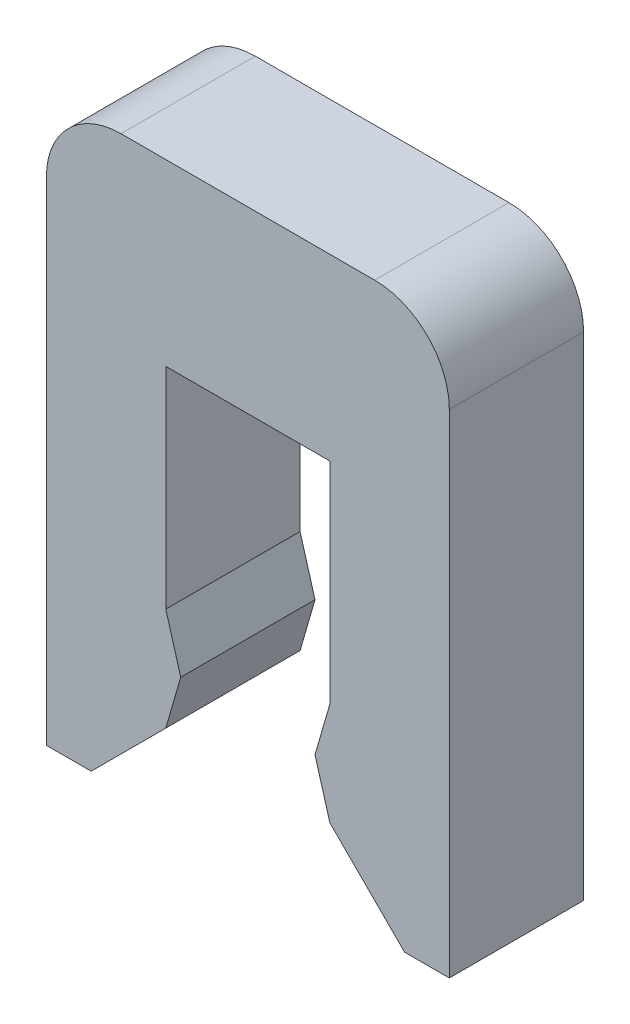
ISO-10303-21;
HEADER;
FILE_DESCRIPTION(('STEP AP214'),'2;1');
FILE_NAME('part.step','',(''),(''),'','','');
FILE_SCHEMA(('AUTOMOTIVE_DESIGN { 1 0 10303 214 1 1 1 1 }'));
ENDSEC;
DATA;
#1=APPLICATION_CONTEXT('core data for automotive mechanical design processes');
#2=APPLICATION_PROTOCOL_DEFINITION('international standard','automotive_design',2000,#1);
#3=PRODUCT_CONTEXT('',#1,'mechanical');
#4=PRODUCT('Part','Part','',(#3));
#5=PRODUCT_RELATED_PRODUCT_CATEGORY('part','',(#4));
#6=PRODUCT_DEFINITION_FORMATION('','',#4);
#7=PRODUCT_DEFINITION_CONTEXT('part definition',#1,'design');
#8=PRODUCT_DEFINITION('design','',#6,#7);
#9=PRODUCT_DEFINITION_SHAPE('','',#8);
#10=(LENGTH_UNIT() NAMED_UNIT(*) SI_UNIT(.MILLI.,.METRE.));
#11=(NAMED_UNIT(*) PLANE_ANGLE_UNIT() SI_UNIT($,.RADIAN.));
#12=(NAMED_UNIT(*) SI_UNIT($,.STERADIAN.) SOLID_ANGLE_UNIT());
#13=UNCERTAINTY_MEASURE_WITH_UNIT(LENGTH_MEASURE(1.E-05),#10,'distance_accuracy_value','');
#14=(GEOMETRIC_REPRESENTATION_CONTEXT(3) GLOBAL_UNCERTAINTY_ASSIGNED_CONTEXT((#13)) GLOBAL_UNIT_ASSIGNED_CONTEXT((#10,
#11,#12)) REPRESENTATION_CONTEXT('',''));
#15=CARTESIAN_POINT('',(0.,0.,0.));
#16=DIRECTION('',(0.,0.,1.));
#17=DIRECTION('',(1.,0.,0.));
#18=AXIS2_PLACEMENT_3D('',#15,#16,#17);
#19=CARTESIAN_POINT('',(0.55,0.,0.9));
#20=DIRECTION('',(1.,0.,0.));
#21=DIRECTION('',(0.,1.,0.));
#22=AXIS2_PLACEMENT_3D('',#19,#20,#21);
#23=PLANE('',#22);
#24=DIRECTION('',(0.,0.,1.));
#25=VECTOR('',#24,1.);
#26=CARTESIAN_POINT('',(0.55,-1.40904092317434,0.));
#27=LINE('',#26,#25);
#28=CARTESIAN_POINT('',(0.55,-1.40904092317434,0.));
#29=VERTEX_POINT('',#28);
#30=CARTESIAN_POINT('',(0.55,-1.40904092317434,0.9));
#31=VERTEX_POINT('',#30);
#32=EDGE_CURVE('E50',#29,#31,#27,.T.);
#33=ORIENTED_EDGE('',*,*,#32,.T.);
#34=DIRECTION('',(0.,-1.,0.));
#35=VECTOR('',#34,1.);
#36=CARTESIAN_POINT('',(0.55,0.,0.9));
#37=LINE('',#36,#35);
#38=CARTESIAN_POINT('',(0.55,0.,0.9));
#39=VERTEX_POINT('',#38);
#40=EDGE_CURVE('E193',#39,#31,#37,.T.);
#41=ORIENTED_EDGE('',*,*,#40,.F.);
#42=DIRECTION('',(0.,0.,-1.));
#43=VECTOR('',#42,1.);
#44=CARTESIAN_POINT('',(0.55,0.,0.9));
#45=LINE('',#44,#43);
#46=CARTESIAN_POINT('',(0.55,0.,0.));
#47=VERTEX_POINT('',#46);
#48=EDGE_CURVE('E213',#39,#47,#45,.T.);
#49=ORIENTED_EDGE('',*,*,#48,.T.);
#50=DIRECTION('',(0.,-1.,0.));
#51=VECTOR('',#50,1.);
#52=CARTESIAN_POINT('',(0.55,0.,0.));
#53=LINE('',#52,#51);
#54=EDGE_CURVE('E55',#47,#29,#53,.T.);
#55=ORIENTED_EDGE('',*,*,#54,.T.);
#56=EDGE_LOOP('',(#33,#41,#49,#55));
#57=FACE_BOUND('',#56,.T.);
#58=ADVANCED_FACE('F35',(#57),#23,.F.);
#59=CARTESIAN_POINT('',(0.55,-2.6,0.9));
#60=DIRECTION('',(0.,1.,0.));
#61=DIRECTION('',(0.,0.,1.));
#62=AXIS2_PLACEMENT_3D('',#59,#60,#61);
#63=PLANE('',#62);
#64=DIRECTION('',(1.,0.,0.));
#65=VECTOR('',#64,1.);
#66=CARTESIAN_POINT('',(0.55,-2.6,0.9));
#67=LINE('',#66,#65);
#68=CARTESIAN_POINT('',(1.05,-2.6,0.9));
#69=VERTEX_POINT('',#68);
#70=CARTESIAN_POINT('',(1.35,-2.6,0.9));
#71=VERTEX_POINT('',#70);
#72=EDGE_CURVE('E195',#69,#71,#67,.T.);
#73=ORIENTED_EDGE('',*,*,#72,.F.);
#74=DIRECTION('',(0.,0.,-1.));
#75=VECTOR('',#74,1.);
#76=CARTESIAN_POINT('',(1.05,-2.6,0.9));
#77=LINE('',#76,#75);
#78=CARTESIAN_POINT('',(1.05,-2.6,0.));
#79=VERTEX_POINT('',#78);
#80=EDGE_CURVE('E253',#69,#79,#77,.T.);
#81=ORIENTED_EDGE('',*,*,#80,.T.);
#82=DIRECTION('',(1.,0.,0.));
#83=VECTOR('',#82,1.);
#84=CARTESIAN_POINT('',(0.55,-2.6,0.));
#85=LINE('',#84,#83);
#86=CARTESIAN_POINT('',(1.35,-2.6,0.));
#87=VERTEX_POINT('',#86);
#88=EDGE_CURVE('E215',#79,#87,#85,.T.);
#89=ORIENTED_EDGE('',*,*,#88,.T.);
#90=DIRECTION('',(0.,0.,-1.));
#91=VECTOR('',#90,1.);
#92=CARTESIAN_POINT('',(1.35,-2.6,0.9));
#93=LINE('',#92,#91);
#94=EDGE_CURVE('E238',#71,#87,#93,.T.);
#95=ORIENTED_EDGE('',*,*,#94,.F.);
#96=EDGE_LOOP('',(#73,#81,#89,#95));
#97=FACE_BOUND('',#96,.T.);
#98=ADVANCED_FACE('F289',(#97),#63,.F.);
#99=CARTESIAN_POINT('',(1.35,-2.6,0.9));
#100=DIRECTION('',(-1.,0.,0.));
#101=DIRECTION('',(0.,0.,1.));
#102=AXIS2_PLACEMENT_3D('',#99,#100,#101);
#103=PLANE('',#102);
#104=DIRECTION('',(0.,1.,0.));
#105=VECTOR('',#104,1.);
#106=CARTESIAN_POINT('',(1.35,-2.6,0.));
#107=LINE('',#106,#105);
#108=CARTESIAN_POINT('',(1.35,0.699999999999999,0.));
#109=VERTEX_POINT('',#108);
#110=EDGE_CURVE('E217',#87,#109,#107,.T.);
#111=ORIENTED_EDGE('',*,*,#110,.T.);
#112=DIRECTION('',(0.,0.,-1.));
#113=VECTOR('',#112,1.);
#114=CARTESIAN_POINT('',(1.35,0.7,0.9));
#115=LINE('',#114,#113);
#116=CARTESIAN_POINT('',(1.35,0.699999999999999,0.9));
#117=VERTEX_POINT('',#116);
#118=EDGE_CURVE('E267',#109,#117,#115,.F.);
#119=ORIENTED_EDGE('',*,*,#118,.T.);
#120=DIRECTION('',(0.,1.,0.));
#121=VECTOR('',#120,1.);
#122=CARTESIAN_POINT('',(1.35,-2.6,0.9));
#123=LINE('',#122,#121);
#124=EDGE_CURVE('E198',#71,#117,#123,.T.);
#125=ORIENTED_EDGE('',*,*,#124,.F.);
#126=ORIENTED_EDGE('',*,*,#94,.T.);
#127=EDGE_LOOP('',(#111,#119,#125,#126));
#128=FACE_BOUND('',#127,.T.);
#129=ADVANCED_FACE('F285',(#128),#103,.F.);
#130=CARTESIAN_POINT('',(1.35,1.2,0.9));
#131=DIRECTION('',(0.,-1.,0.));
#132=DIRECTION('',(1.,0.,0.));
#133=AXIS2_PLACEMENT_3D('',#130,#131,#132);
#134=PLANE('',#133);
#135=DIRECTION('',(-1.,0.,0.));
#136=VECTOR('',#135,1.);
#137=CARTESIAN_POINT('',(1.35,1.2,0.9));
#138=LINE('',#137,#136);
#139=CARTESIAN_POINT('',(0.850000000000001,1.2,0.9));
#140=VERTEX_POINT('',#139);
#141=CARTESIAN_POINT('',(-0.85,1.2,0.9));
#142=VERTEX_POINT('',#141);
#143=EDGE_CURVE('E201',#140,#142,#138,.T.);
#144=ORIENTED_EDGE('',*,*,#143,.F.);
#145=DIRECTION('',(0.,0.,-1.));
#146=VECTOR('',#145,1.);
#147=CARTESIAN_POINT('',(0.850000000000001,1.2,0.9));
#148=LINE('',#147,#146);
#149=CARTESIAN_POINT('',(0.850000000000001,1.2,0.));
#150=VERTEX_POINT('',#149);
#151=EDGE_CURVE('E260',#140,#150,#148,.T.);
#152=ORIENTED_EDGE('',*,*,#151,.T.);
#153=DIRECTION('',(-1.,0.,0.));
#154=VECTOR('',#153,1.);
#155=CARTESIAN_POINT('',(1.35,1.2,0.));
#156=LINE('',#155,#154);
#157=CARTESIAN_POINT('',(-0.85,1.2,0.));
#158=VERTEX_POINT('',#157);
#159=EDGE_CURVE('E220',#150,#158,#156,.T.);
#160=ORIENTED_EDGE('',*,*,#159,.T.);
#161=DIRECTION('',(0.,0.,-1.));
#162=VECTOR('',#161,1.);
#163=CARTESIAN_POINT('',(-0.850000000000001,1.2,0.9));
#164=LINE('',#163,#162);
#165=EDGE_CURVE('E258',#158,#142,#164,.F.);
#166=ORIENTED_EDGE('',*,*,#165,.T.);
#167=EDGE_LOOP('',(#144,#152,#160,#166));
#168=FACE_BOUND('',#167,.T.);
#169=ADVANCED_FACE('F280',(#168),#134,.F.);
#170=CARTESIAN_POINT('',(-1.35,-2.6,0.9));
#171=DIRECTION('',(1.,0.,0.));
#172=DIRECTION('',(0.,1.,0.));
#173=AXIS2_PLACEMENT_3D('',#170,#171,#172);
#174=PLANE('',#173);
#175=DIRECTION('',(0.,-1.,0.));
#176=VECTOR('',#175,1.);
#177=CARTESIAN_POINT('',(-1.35,-2.6,0.9));
#178=LINE('',#177,#176);
#179=CARTESIAN_POINT('',(-1.35,0.7,0.9));
#180=VERTEX_POINT('',#179);
#181=CARTESIAN_POINT('',(-1.35,-2.6,0.9));
#182=VERTEX_POINT('',#181);
#183=EDGE_CURVE('E204',#180,#182,#178,.T.);
#184=ORIENTED_EDGE('',*,*,#183,.F.);
#185=DIRECTION('',(0.,0.,-1.));
#186=VECTOR('',#185,1.);
#187=CARTESIAN_POINT('',(-1.35,0.7,0.9));
#188=LINE('',#187,#186);
#189=CARTESIAN_POINT('',(-1.35,0.7,0.));
#190=VERTEX_POINT('',#189);
#191=EDGE_CURVE('E11',#180,#190,#188,.T.);
#192=ORIENTED_EDGE('',*,*,#191,.T.);
#193=DIRECTION('',(0.,-1.,0.));
#194=VECTOR('',#193,1.);
#195=CARTESIAN_POINT('',(-1.35,-2.6,0.));
#196=LINE('',#195,#194);
#197=CARTESIAN_POINT('',(-1.35,-2.6,0.));
#198=VERTEX_POINT('',#197);
#199=EDGE_CURVE('E223',#190,#198,#196,.T.);
#200=ORIENTED_EDGE('',*,*,#199,.T.);
#201=DIRECTION('',(0.,0.,-1.));
#202=VECTOR('',#201,1.);
#203=CARTESIAN_POINT('',(-1.35,-2.6,0.9));
#204=LINE('',#203,#202);
#205=EDGE_CURVE('E235',#182,#198,#204,.T.);
#206=ORIENTED_EDGE('',*,*,#205,.F.);
#207=EDGE_LOOP('',(#184,#192,#200,#206));
#208=FACE_BOUND('',#207,.T.);
#209=ADVANCED_FACE('F340',(#208),#174,.F.);
#210=CARTESIAN_POINT('',(-0.55,-2.6,0.9));
#211=DIRECTION('',(0.,1.,0.));
#212=DIRECTION('',(0.,0.,1.));
#213=AXIS2_PLACEMENT_3D('',#210,#211,#212);
#214=PLANE('',#213);
#215=DIRECTION('',(1.,0.,0.));
#216=VECTOR('',#215,1.);
#217=CARTESIAN_POINT('',(-0.55,-2.6,0.));
#218=LINE('',#217,#216);
#219=CARTESIAN_POINT('',(-1.05,-2.6,0.));
#220=VERTEX_POINT('',#219);
#221=EDGE_CURVE('E225',#198,#220,#218,.T.);
#222=ORIENTED_EDGE('',*,*,#221,.T.);
#223=DIRECTION('',(0.,0.,1.));
#224=VECTOR('',#223,1.);
#225=CARTESIAN_POINT('',(-1.05,-2.6,0.9));
#226=LINE('',#225,#224);
#227=CARTESIAN_POINT('',(-1.05,-2.6,0.9));
#228=VERTEX_POINT('',#227);
#229=EDGE_CURVE('E247',#220,#228,#226,.T.);
#230=ORIENTED_EDGE('',*,*,#229,.T.);
#231=DIRECTION('',(1.,0.,0.));
#232=VECTOR('',#231,1.);
#233=CARTESIAN_POINT('',(-0.55,-2.6,0.9));
#234=LINE('',#233,#232);
#235=EDGE_CURVE('E206',#182,#228,#234,.T.);
#236=ORIENTED_EDGE('',*,*,#235,.F.);
#237=ORIENTED_EDGE('',*,*,#205,.T.);
#238=EDGE_LOOP('',(#222,#230,#236,#237));
#239=FACE_BOUND('',#238,.T.);
#240=ADVANCED_FACE('F317',(#239),#214,.F.);
#241=CARTESIAN_POINT('',(-0.55,0.,0.9));
#242=DIRECTION('',(-1.,0.,0.));
#243=DIRECTION('',(0.,-1.,0.));
#244=AXIS2_PLACEMENT_3D('',#241,#242,#243);
#245=PLANE('',#244);
#246=DIRECTION('',(0.,1.,0.));
#247=VECTOR('',#246,1.);
#248=CARTESIAN_POINT('',(-0.55,0.,0.9));
#249=LINE('',#248,#247);
#250=CARTESIAN_POINT('',(-0.55,-1.40904092317434,0.9));
#251=VERTEX_POINT('',#250);
#252=CARTESIAN_POINT('',(-0.55,0.,0.9));
#253=VERTEX_POINT('',#252);
#254=EDGE_CURVE('E209',#251,#253,#249,.T.);
#255=ORIENTED_EDGE('',*,*,#254,.F.);
#256=DIRECTION('',(0.,0.,1.));
#257=VECTOR('',#256,1.);
#258=CARTESIAN_POINT('',(-0.55,-1.40904092317434,0.));
#259=LINE('',#258,#257);
#260=CARTESIAN_POINT('',(-0.55,-1.40904092317434,0.));
#261=VERTEX_POINT('',#260);
#262=EDGE_CURVE('E189',#261,#251,#259,.T.);
#263=ORIENTED_EDGE('',*,*,#262,.F.);
#264=DIRECTION('',(0.,1.,0.));
#265=VECTOR('',#264,1.);
#266=CARTESIAN_POINT('',(-0.55,0.,0.));
#267=LINE('',#266,#265);
#268=CARTESIAN_POINT('',(-0.55,0.,0.));
#269=VERTEX_POINT('',#268);
#270=EDGE_CURVE('E228',#261,#269,#267,.T.);
#271=ORIENTED_EDGE('',*,*,#270,.T.);
#272=DIRECTION('',(0.,0.,-1.));
#273=VECTOR('',#272,1.);
#274=CARTESIAN_POINT('',(-0.55,0.,0.9));
#275=LINE('',#274,#273);
#276=EDGE_CURVE('E232',#253,#269,#275,.T.);
#277=ORIENTED_EDGE('',*,*,#276,.F.);
#278=EDGE_LOOP('',(#255,#263,#271,#277));
#279=FACE_BOUND('',#278,.T.);
#280=ADVANCED_FACE('F302',(#279),#245,.F.);
#281=CARTESIAN_POINT('',(-0.55,0.,0.9));
#282=DIRECTION('',(0.,1.,0.));
#283=DIRECTION('',(-1.,0.,0.));
#284=AXIS2_PLACEMENT_3D('',#281,#282,#283);
#285=PLANE('',#284);
#286=DIRECTION('',(1.,0.,0.));
#287=VECTOR('',#286,1.);
#288=CARTESIAN_POINT('',(-0.55,0.,0.));
#289=LINE('',#288,#287);
#290=EDGE_CURVE('E196',#269,#47,#289,.T.);
#291=ORIENTED_EDGE('',*,*,#290,.T.);
#292=ORIENTED_EDGE('',*,*,#48,.F.);
#293=DIRECTION('',(1.,0.,0.));
#294=VECTOR('',#293,1.);
#295=CARTESIAN_POINT('',(-0.55,0.,0.9));
#296=LINE('',#295,#294);
#297=EDGE_CURVE('E211',#253,#39,#296,.T.);
#298=ORIENTED_EDGE('',*,*,#297,.F.);
#299=ORIENTED_EDGE('',*,*,#276,.T.);
#300=EDGE_LOOP('',(#291,#292,#298,#299));
#301=FACE_BOUND('',#300,.T.);
#302=ADVANCED_FACE('F299',(#301),#285,.F.);
#303=CARTESIAN_POINT('',(0.,0.,0.9));
#304=DIRECTION('',(0.,0.,1.));
#305=DIRECTION('',(1.,0.,0.));
#306=AXIS2_PLACEMENT_3D('',#303,#304,#305);
#307=PLANE('',#306);
#308=ORIENTED_EDGE('',*,*,#124,.T.);
#309=CARTESIAN_POINT('',(0.850000000000001,0.7,0.9));
#310=DIRECTION('',(0.,0.,1.));
#311=DIRECTION('',(1.,0.,0.));
#312=AXIS2_PLACEMENT_3D('',#309,#310,#311);
#313=CIRCLE('',#312,0.5);
#314=EDGE_CURVE('E43',#117,#140,#313,.T.);
#315=ORIENTED_EDGE('',*,*,#314,.T.);
#316=ORIENTED_EDGE('',*,*,#143,.T.);
#317=CARTESIAN_POINT('',(-0.85,0.7,0.9));
#318=DIRECTION('',(0.,0.,1.));
#319=DIRECTION('',(1.,0.,0.));
#320=AXIS2_PLACEMENT_3D('',#317,#318,#319);
#321=CIRCLE('',#320,0.5);
#322=EDGE_CURVE('E269',#142,#180,#321,.T.);
#323=ORIENTED_EDGE('',*,*,#322,.T.);
#324=ORIENTED_EDGE('',*,*,#183,.T.);
#325=ORIENTED_EDGE('',*,*,#235,.T.);
#326=DIRECTION('',(-0.707106781186549,-0.707106781186546,0.));
#327=VECTOR('',#326,1.);
#328=CARTESIAN_POINT('',(0.775000000000001,-0.775000000000003,0.9));
#329=LINE('',#328,#327);
#330=CARTESIAN_POINT('',(-0.55,-2.1,0.9));
#331=VERTEX_POINT('',#330);
#332=EDGE_CURVE('E251',#228,#331,#329,.F.);
#333=ORIENTED_EDGE('',*,*,#332,.T.);
#334=DIRECTION('',(0.278039516140577,0.960569636967729,0.));
#335=VECTOR('',#334,1.);
#336=CARTESIAN_POINT('',(-0.45,-1.75452046158717,0.9));
#337=LINE('',#336,#335);
#338=CARTESIAN_POINT('',(-0.45,-1.75452046158717,0.9));
#339=VERTEX_POINT('',#338);
#340=EDGE_CURVE('E171',#331,#339,#337,.T.);
#341=ORIENTED_EDGE('',*,*,#340,.T.);
#342=DIRECTION('',(-0.278039516140577,0.960569636967729,0.));
#343=VECTOR('',#342,1.);
#344=CARTESIAN_POINT('',(-0.55,-1.40904092317434,0.9));
#345=LINE('',#344,#343);
#346=EDGE_CURVE('E174',#339,#251,#345,.T.);
#347=ORIENTED_EDGE('',*,*,#346,.T.);
#348=ORIENTED_EDGE('',*,*,#254,.T.);
#349=ORIENTED_EDGE('',*,*,#297,.T.);
#350=ORIENTED_EDGE('',*,*,#40,.T.);
#351=DIRECTION('',(0.278039516140577,0.960569636967729,0.));
#352=VECTOR('',#351,1.);
#353=CARTESIAN_POINT('',(0.55,-1.40904092317434,0.9));
#354=LINE('',#353,#352);
#355=CARTESIAN_POINT('',(0.45,-1.75452046158717,0.9));
#356=VERTEX_POINT('',#355);
#357=EDGE_CURVE('E166',#356,#31,#354,.T.);
#358=ORIENTED_EDGE('',*,*,#357,.F.);
#359=DIRECTION('',(-0.278039516140577,0.960569636967729,0.));
#360=VECTOR('',#359,1.);
#361=CARTESIAN_POINT('',(0.45,-1.75452046158717,0.9));
#362=LINE('',#361,#360);
#363=CARTESIAN_POINT('',(0.55,-2.1,0.9));
#364=VERTEX_POINT('',#363);
#365=EDGE_CURVE('E170',#364,#356,#362,.T.);
#366=ORIENTED_EDGE('',*,*,#365,.F.);
#367=DIRECTION('',(-0.707106781186546,0.707106781186549,0.));
#368=VECTOR('',#367,1.);
#369=CARTESIAN_POINT('',(-0.774999999999998,-0.774999999999996,0.9));
#370=LINE('',#369,#368);
#371=EDGE_CURVE('E249',#364,#69,#370,.F.);
#372=ORIENTED_EDGE('',*,*,#371,.T.);
#373=ORIENTED_EDGE('',*,*,#72,.T.);
#374=EDGE_LOOP('',(#308,#315,#316,#323,#324,#325,#333,#341,#347,#348,#349,#350,#358,#366,#372,#373));
#375=FACE_BOUND('',#374,.T.);
#376=ADVANCED_FACE('F273',(#375),#307,.T.);
#377=CARTESIAN_POINT('',(0.,0.,0.));
#378=DIRECTION('',(0.,0.,1.));
#379=DIRECTION('',(1.,0.,0.));
#380=AXIS2_PLACEMENT_3D('',#377,#378,#379);
#381=PLANE('',#380);
#382=ORIENTED_EDGE('',*,*,#159,.F.);
#383=CARTESIAN_POINT('',(0.850000000000001,0.7,0.));
#384=DIRECTION('',(0.,0.,1.));
#385=DIRECTION('',(1.,0.,0.));
#386=AXIS2_PLACEMENT_3D('',#383,#384,#385);
#387=CIRCLE('',#386,0.5);
#388=EDGE_CURVE('E265',#150,#109,#387,.F.);
#389=ORIENTED_EDGE('',*,*,#388,.T.);
#390=ORIENTED_EDGE('',*,*,#110,.F.);
#391=ORIENTED_EDGE('',*,*,#88,.F.);
#392=DIRECTION('',(0.707106781186546,-0.707106781186549,0.));
#393=VECTOR('',#392,1.);
#394=CARTESIAN_POINT('',(1.05,-2.6,0.));
#395=LINE('',#394,#393);
#396=CARTESIAN_POINT('',(0.55,-2.1,0.));
#397=VERTEX_POINT('',#396);
#398=EDGE_CURVE('E162',#79,#397,#395,.F.);
#399=ORIENTED_EDGE('',*,*,#398,.T.);
#400=DIRECTION('',(-0.278039516140577,0.960569636967729,0.));
#401=VECTOR('',#400,1.);
#402=CARTESIAN_POINT('',(0.45,-1.75452046158717,0.));
#403=LINE('',#402,#401);
#404=CARTESIAN_POINT('',(0.45,-1.75452046158717,0.));
#405=VERTEX_POINT('',#404);
#406=EDGE_CURVE('E156',#397,#405,#403,.T.);
#407=ORIENTED_EDGE('',*,*,#406,.T.);
#408=DIRECTION('',(0.278039516140577,0.960569636967729,0.));
#409=VECTOR('',#408,1.);
#410=CARTESIAN_POINT('',(0.55,-1.40904092317434,0.));
#411=LINE('',#410,#409);
#412=EDGE_CURVE('E148',#405,#29,#411,.T.);
#413=ORIENTED_EDGE('',*,*,#412,.T.);
#414=ORIENTED_EDGE('',*,*,#54,.F.);
#415=ORIENTED_EDGE('',*,*,#290,.F.);
#416=ORIENTED_EDGE('',*,*,#270,.F.);
#417=DIRECTION('',(-0.278039516140577,0.960569636967729,0.));
#418=VECTOR('',#417,1.);
#419=CARTESIAN_POINT('',(-0.55,-1.40904092317434,0.));
#420=LINE('',#419,#418);
#421=CARTESIAN_POINT('',(-0.45,-1.75452046158717,0.));
#422=VERTEX_POINT('',#421);
#423=EDGE_CURVE('E183',#422,#261,#420,.T.);
#424=ORIENTED_EDGE('',*,*,#423,.F.);
#425=DIRECTION('',(0.278039516140577,0.960569636967729,0.));
#426=VECTOR('',#425,1.);
#427=CARTESIAN_POINT('',(-0.45,-1.75452046158717,0.));
#428=LINE('',#427,#426);
#429=CARTESIAN_POINT('',(-0.55,-2.1,0.));
#430=VERTEX_POINT('',#429);
#431=EDGE_CURVE('E180',#430,#422,#428,.T.);
#432=ORIENTED_EDGE('',*,*,#431,.F.);
#433=DIRECTION('',(0.707106781186549,0.707106781186546,0.));
#434=VECTOR('',#433,1.);
#435=CARTESIAN_POINT('',(-0.55,-2.1,0.));
#436=LINE('',#435,#434);
#437=EDGE_CURVE('E245',#430,#220,#436,.F.);
#438=ORIENTED_EDGE('',*,*,#437,.T.);
#439=ORIENTED_EDGE('',*,*,#221,.F.);
#440=ORIENTED_EDGE('',*,*,#199,.F.);
#441=CARTESIAN_POINT('',(-0.85,0.7,0.));
#442=DIRECTION('',(0.,0.,1.));
#443=DIRECTION('',(1.,0.,0.));
#444=AXIS2_PLACEMENT_3D('',#441,#442,#443);
#445=CIRCLE('',#444,0.5);
#446=EDGE_CURVE('E263',#190,#158,#445,.F.);
#447=ORIENTED_EDGE('',*,*,#446,.T.);
#448=EDGE_LOOP('',(#382,#389,#390,#391,#399,#407,#413,#414,#415,#416,#424,#432,#438,#439,#440,#447));
#449=FACE_BOUND('',#448,.T.);
#450=ADVANCED_FACE('F160',(#449),#381,.F.);
#451=CARTESIAN_POINT('',(-0.55,-2.1,0.9));
#452=DIRECTION('',(-0.707106781186546,0.707106781186549,0.));
#453=DIRECTION('',(0.,0.,-1.));
#454=AXIS2_PLACEMENT_3D('',#451,#452,#453);
#455=PLANE('',#454);
#456=ORIENTED_EDGE('',*,*,#332,.F.);
#457=ORIENTED_EDGE('',*,*,#229,.F.);
#458=ORIENTED_EDGE('',*,*,#437,.F.);
#459=DIRECTION('',(0.,0.,-1.));
#460=VECTOR('',#459,1.);
#461=CARTESIAN_POINT('',(-0.55,-2.1,0.9));
#462=LINE('',#461,#460);
#463=EDGE_CURVE('E241',#331,#430,#462,.T.);
#464=ORIENTED_EDGE('',*,*,#463,.F.);
#465=EDGE_LOOP('',(#456,#457,#458,#464));
#466=FACE_BOUND('',#465,.T.);
#467=ADVANCED_FACE('F320',(#466),#455,.F.);
#468=CARTESIAN_POINT('',(1.05,-2.6,0.9));
#469=DIRECTION('',(0.707106781186548,0.707106781186546,0.));
#470=DIRECTION('',(0.,0.,-1.));
#471=AXIS2_PLACEMENT_3D('',#468,#469,#470);
#472=PLANE('',#471);
#473=ORIENTED_EDGE('',*,*,#371,.F.);
#474=DIRECTION('',(0.,0.,1.));
#475=VECTOR('',#474,1.);
#476=CARTESIAN_POINT('',(0.55,-2.1,0.9));
#477=LINE('',#476,#475);
#478=EDGE_CURVE('E256',#397,#364,#477,.T.);
#479=ORIENTED_EDGE('',*,*,#478,.F.);
#480=ORIENTED_EDGE('',*,*,#398,.F.);
#481=ORIENTED_EDGE('',*,*,#80,.F.);
#482=EDGE_LOOP('',(#473,#479,#480,#481));
#483=FACE_BOUND('',#482,.T.);
#484=ADVANCED_FACE('F292',(#483),#472,.F.);
#485=CARTESIAN_POINT('',(0.850000000000001,0.7,0.9));
#486=DIRECTION('',(0.,0.,-1.));
#487=DIRECTION('',(-1.,0.,0.));
#488=AXIS2_PLACEMENT_3D('',#485,#486,#487);
#489=CYLINDRICAL_SURFACE('',#488,0.5);
#490=ORIENTED_EDGE('',*,*,#314,.F.);
#491=ORIENTED_EDGE('',*,*,#118,.F.);
#492=ORIENTED_EDGE('',*,*,#388,.F.);
#493=ORIENTED_EDGE('',*,*,#151,.F.);
#494=EDGE_LOOP('',(#490,#491,#492,#493));
#495=FACE_BOUND('',#494,.T.);
#496=ADVANCED_FACE('F282',(#495),#489,.T.);
#497=CARTESIAN_POINT('',(-0.85,0.7,0.9));
#498=DIRECTION('',(0.,0.,-1.));
#499=DIRECTION('',(-1.,0.,0.));
#500=AXIS2_PLACEMENT_3D('',#497,#498,#499);
#501=CYLINDRICAL_SURFACE('',#500,0.5);
#502=ORIENTED_EDGE('',*,*,#322,.F.);
#503=ORIENTED_EDGE('',*,*,#165,.F.);
#504=ORIENTED_EDGE('',*,*,#446,.F.);
#505=ORIENTED_EDGE('',*,*,#191,.F.);
#506=EDGE_LOOP('',(#502,#503,#504,#505));
#507=FACE_BOUND('',#506,.T.);
#508=ADVANCED_FACE('F37',(#507),#501,.T.);
#509=CARTESIAN_POINT('',(-0.45,-1.75452046158717,0.));
#510=DIRECTION('',(0.960569636967729,-0.278039516140577,0.));
#511=DIRECTION('',(0.278039516140577,0.960569636967729,0.));
#512=AXIS2_PLACEMENT_3D('',#509,#510,#511);
#513=PLANE('',#512);
#514=ORIENTED_EDGE('',*,*,#340,.F.);
#515=ORIENTED_EDGE('',*,*,#463,.T.);
#516=ORIENTED_EDGE('',*,*,#431,.T.);
#517=DIRECTION('',(0.,0.,1.));
#518=VECTOR('',#517,1.);
#519=CARTESIAN_POINT('',(-0.45,-1.75452046158717,0.));
#520=LINE('',#519,#518);
#521=EDGE_CURVE('E185',#422,#339,#520,.T.);
#522=ORIENTED_EDGE('',*,*,#521,.T.);
#523=EDGE_LOOP('',(#514,#515,#516,#522));
#524=FACE_BOUND('',#523,.T.);
#525=ADVANCED_FACE('F310',(#524),#513,.T.);
#526=CARTESIAN_POINT('',(-0.55,-1.40904092317434,0.));
#527=DIRECTION('',(0.960569636967729,0.278039516140577,0.));
#528=DIRECTION('',(-0.278039516140577,0.960569636967729,0.));
#529=AXIS2_PLACEMENT_3D('',#526,#527,#528);
#530=PLANE('',#529);
#531=ORIENTED_EDGE('',*,*,#346,.F.);
#532=ORIENTED_EDGE('',*,*,#521,.F.);
#533=ORIENTED_EDGE('',*,*,#423,.T.);
#534=ORIENTED_EDGE('',*,*,#262,.T.);
#535=EDGE_LOOP('',(#531,#532,#533,#534));
#536=FACE_BOUND('',#535,.T.);
#537=ADVANCED_FACE('F305',(#536),#530,.T.);
#538=CARTESIAN_POINT('',(0.45,-1.75452046158717,0.));
#539=DIRECTION('',(0.960569636967729,0.278039516140577,0.));
#540=DIRECTION('',(-0.278039516140577,0.960569636967729,0.));
#541=AXIS2_PLACEMENT_3D('',#538,#539,#540);
#542=PLANE('',#541);
#543=ORIENTED_EDGE('',*,*,#365,.T.);
#544=DIRECTION('',(0.,0.,1.));
#545=VECTOR('',#544,1.);
#546=CARTESIAN_POINT('',(0.45,-1.75452046158717,0.));
#547=LINE('',#546,#545);
#548=EDGE_CURVE('E153',#405,#356,#547,.T.);
#549=ORIENTED_EDGE('',*,*,#548,.F.);
#550=ORIENTED_EDGE('',*,*,#406,.F.);
#551=ORIENTED_EDGE('',*,*,#478,.T.);
#552=EDGE_LOOP('',(#543,#549,#550,#551));
#553=FACE_BOUND('',#552,.T.);
#554=ADVANCED_FACE('F168',(#553),#542,.F.);
#555=CARTESIAN_POINT('',(0.55,-1.40904092317434,0.));
#556=DIRECTION('',(0.960569636967729,-0.278039516140577,0.));
#557=DIRECTION('',(0.278039516140577,0.960569636967729,0.));
#558=AXIS2_PLACEMENT_3D('',#555,#556,#557);
#559=PLANE('',#558);
#560=ORIENTED_EDGE('',*,*,#357,.T.);
#561=ORIENTED_EDGE('',*,*,#32,.F.);
#562=ORIENTED_EDGE('',*,*,#412,.F.);
#563=ORIENTED_EDGE('',*,*,#548,.T.);
#564=EDGE_LOOP('',(#560,#561,#562,#563));
#565=FACE_BOUND('',#564,.T.);
#566=ADVANCED_FACE('F151',(#565),#559,.F.);
#567=CLOSED_SHELL('',(#58,#98,#129,#169,#209,#240,#280,#302,#376,#450,#467,#484,#496,#508,#525,
#537,#554,#566));
#568=MANIFOLD_SOLID_BREP('B2',#567);
#569=ADVANCED_BREP_SHAPE_REPRESENTATION('',(#18,#568),#14);
#570=SHAPE_DEFINITION_REPRESENTATION(#9,#569);
ENDSEC;
END-ISO-10303-21;
